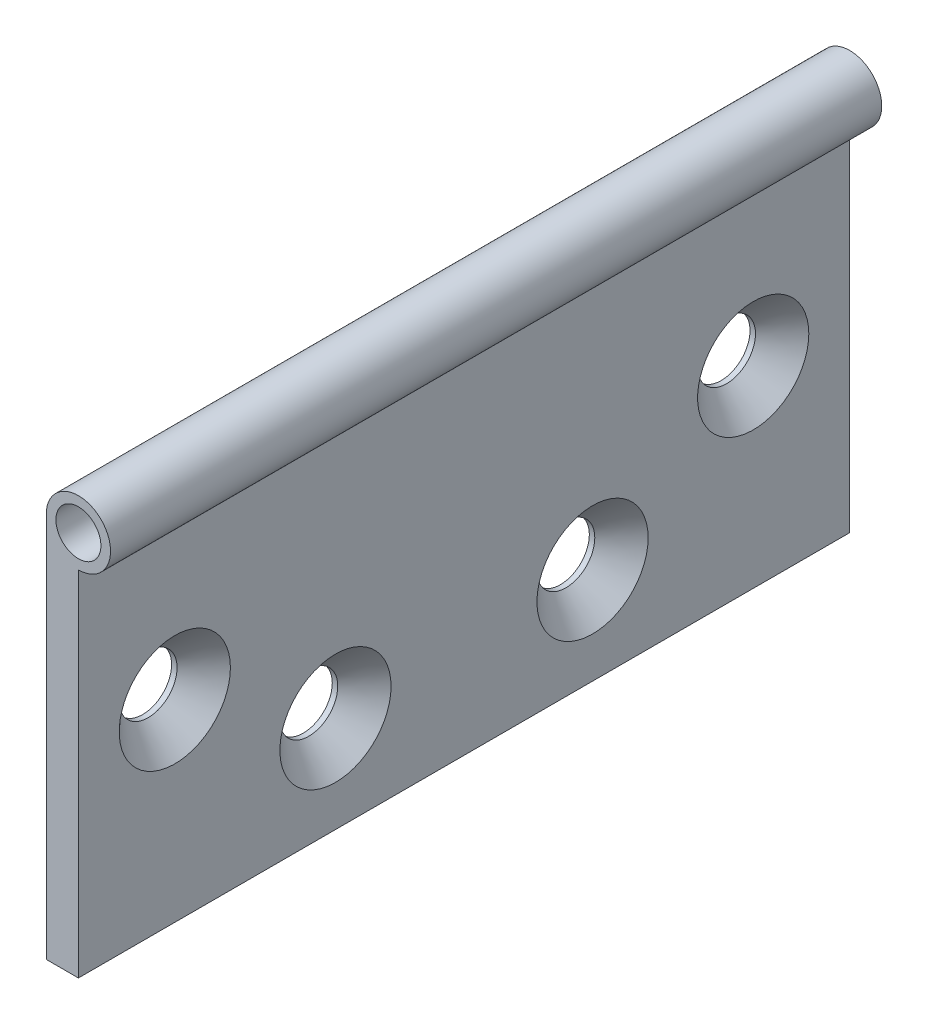
ISO-10303-21;
HEADER;
FILE_DESCRIPTION(('STEP AP214'),'2;1');
FILE_NAME('part.step','',(''),(''),'','','');
FILE_SCHEMA(('AUTOMOTIVE_DESIGN { 1 0 10303 214 1 1 1 1 }'));
ENDSEC;
DATA;
#1=APPLICATION_CONTEXT('core data for automotive mechanical design processes');
#2=APPLICATION_PROTOCOL_DEFINITION('international standard','automotive_design',2000,#1);
#3=PRODUCT_CONTEXT('',#1,'mechanical');
#4=PRODUCT('Part','Part','',(#3));
#5=PRODUCT_RELATED_PRODUCT_CATEGORY('part','',(#4));
#6=PRODUCT_DEFINITION_FORMATION('','',#4);
#7=PRODUCT_DEFINITION_CONTEXT('part definition',#1,'design');
#8=PRODUCT_DEFINITION('design','',#6,#7);
#9=PRODUCT_DEFINITION_SHAPE('','',#8);
#10=(LENGTH_UNIT() NAMED_UNIT(*) SI_UNIT(.MILLI.,.METRE.));
#11=(NAMED_UNIT(*) PLANE_ANGLE_UNIT() SI_UNIT($,.RADIAN.));
#12=(NAMED_UNIT(*) SI_UNIT($,.STERADIAN.) SOLID_ANGLE_UNIT());
#13=UNCERTAINTY_MEASURE_WITH_UNIT(LENGTH_MEASURE(1.E-05),#10,'distance_accuracy_value','');
#14=(GEOMETRIC_REPRESENTATION_CONTEXT(3) GLOBAL_UNCERTAINTY_ASSIGNED_CONTEXT((#13)) GLOBAL_UNIT_ASSIGNED_CONTEXT((#10,
#11,#12)) REPRESENTATION_CONTEXT('',''));
#15=CARTESIAN_POINT('',(0.,0.,0.));
#16=DIRECTION('',(0.,0.,1.));
#17=DIRECTION('',(1.,0.,0.));
#18=AXIS2_PLACEMENT_3D('',#15,#16,#17);
#19=CARTESIAN_POINT('',(5.,0.,60.));
#20=DIRECTION('',(-1.,0.,0.));
#21=DIRECTION('',(0.,0.,1.));
#22=AXIS2_PLACEMENT_3D('',#19,#20,#21);
#23=PLANE('',#22);
#24=CARTESIAN_POINT('',(5.,30.,-45.));
#25=DIRECTION('',(1.,0.,0.));
#26=DIRECTION('',(0.,0.,-1.));
#27=AXIS2_PLACEMENT_3D('',#24,#25,#26);
#28=CIRCLE('',#27,8.65);
#29=CARTESIAN_POINT('',(5.,30.,-53.65));
#30=VERTEX_POINT('',#29);
#31=EDGE_CURVE('E136',#30,#30,#28,.T.);
#32=ORIENTED_EDGE('',*,*,#31,.F.);
#33=EDGE_LOOP('',(#32));
#34=FACE_BOUND('',#33,.T.);
#35=CARTESIAN_POINT('',(5.,15.,-20.));
#36=DIRECTION('',(1.,0.,0.));
#37=DIRECTION('',(0.,0.,-1.));
#38=AXIS2_PLACEMENT_3D('',#35,#36,#37);
#39=CIRCLE('',#38,8.65);
#40=CARTESIAN_POINT('',(5.,15.,-28.65));
#41=VERTEX_POINT('',#40);
#42=EDGE_CURVE('E127',#41,#41,#39,.T.);
#43=ORIENTED_EDGE('',*,*,#42,.F.);
#44=EDGE_LOOP('',(#43));
#45=FACE_BOUND('',#44,.T.);
#46=CARTESIAN_POINT('',(5.,30.,45.));
#47=DIRECTION('',(1.,0.,0.));
#48=DIRECTION('',(0.,0.,-1.));
#49=AXIS2_PLACEMENT_3D('',#46,#47,#48);
#50=CIRCLE('',#49,8.65);
#51=CARTESIAN_POINT('',(5.,30.,36.35));
#52=VERTEX_POINT('',#51);
#53=EDGE_CURVE('E118',#52,#52,#50,.T.);
#54=ORIENTED_EDGE('',*,*,#53,.F.);
#55=EDGE_LOOP('',(#54));
#56=FACE_BOUND('',#55,.T.);
#57=CARTESIAN_POINT('',(5.,15.,20.));
#58=DIRECTION('',(1.,0.,0.));
#59=DIRECTION('',(0.,0.,-1.));
#60=AXIS2_PLACEMENT_3D('',#57,#58,#59);
#61=CIRCLE('',#60,8.65);
#62=CARTESIAN_POINT('',(5.,15.,11.35));
#63=VERTEX_POINT('',#62);
#64=EDGE_CURVE('E109',#63,#63,#61,.T.);
#65=ORIENTED_EDGE('',*,*,#64,.F.);
#66=EDGE_LOOP('',(#65));
#67=FACE_BOUND('',#66,.T.);
#68=DIRECTION('',(0.,1.,0.));
#69=VECTOR('',#68,1.);
#70=CARTESIAN_POINT('',(5.,0.,-60.));
#71=LINE('',#70,#69);
#72=CARTESIAN_POINT('',(5.,0.,-60.));
#73=VERTEX_POINT('',#72);
#74=CARTESIAN_POINT('',(5.,55.,-60.));
#75=VERTEX_POINT('',#74);
#76=EDGE_CURVE('E67',#73,#75,#71,.T.);
#77=ORIENTED_EDGE('',*,*,#76,.T.);
#78=DIRECTION('',(0.,0.,1.));
#79=VECTOR('',#78,1.);
#80=CARTESIAN_POINT('',(5.,55.,-60.));
#81=LINE('',#80,#79);
#82=CARTESIAN_POINT('',(5.,55.,60.));
#83=VERTEX_POINT('',#82);
#84=EDGE_CURVE('E81',#75,#83,#81,.T.);
#85=ORIENTED_EDGE('',*,*,#84,.T.);
#86=DIRECTION('',(0.,1.,0.));
#87=VECTOR('',#86,1.);
#88=CARTESIAN_POINT('',(5.,0.,60.));
#89=LINE('',#88,#87);
#90=CARTESIAN_POINT('',(5.,0.,60.));
#91=VERTEX_POINT('',#90);
#92=EDGE_CURVE('E69',#91,#83,#89,.T.);
#93=ORIENTED_EDGE('',*,*,#92,.F.);
#94=DIRECTION('',(0.,0.,-1.));
#95=VECTOR('',#94,1.);
#96=CARTESIAN_POINT('',(5.,0.,60.));
#97=LINE('',#96,#95);
#98=EDGE_CURVE('E50',#91,#73,#97,.T.);
#99=ORIENTED_EDGE('',*,*,#98,.T.);
#100=EDGE_LOOP('',(#77,#85,#93,#99));
#101=FACE_BOUND('',#100,.T.);
#102=ADVANCED_FACE('F34',(#34,#45,#56,#67,#101),#23,.F.);
#103=CARTESIAN_POINT('',(0.,0.,60.));
#104=DIRECTION('',(-1.,0.,0.));
#105=DIRECTION('',(0.,0.,1.));
#106=AXIS2_PLACEMENT_3D('',#103,#104,#105);
#107=PLANE('',#106);
#108=CARTESIAN_POINT('',(0.,30.,-45.));
#109=DIRECTION('',(1.,0.,0.));
#110=DIRECTION('',(0.,0.,-1.));
#111=AXIS2_PLACEMENT_3D('',#108,#109,#110);
#112=CIRCLE('',#111,4.5);
#113=CARTESIAN_POINT('',(0.,30.,-49.5));
#114=VERTEX_POINT('',#113);
#115=EDGE_CURVE('E130',#114,#114,#112,.T.);
#116=ORIENTED_EDGE('',*,*,#115,.T.);
#117=EDGE_LOOP('',(#116));
#118=FACE_BOUND('',#117,.T.);
#119=CARTESIAN_POINT('',(0.,15.,-20.));
#120=DIRECTION('',(1.,0.,0.));
#121=DIRECTION('',(0.,0.,-1.));
#122=AXIS2_PLACEMENT_3D('',#119,#120,#121);
#123=CIRCLE('',#122,4.5);
#124=CARTESIAN_POINT('',(0.,15.,-24.5));
#125=VERTEX_POINT('',#124);
#126=EDGE_CURVE('E121',#125,#125,#123,.T.);
#127=ORIENTED_EDGE('',*,*,#126,.T.);
#128=EDGE_LOOP('',(#127));
#129=FACE_BOUND('',#128,.T.);
#130=CARTESIAN_POINT('',(0.,30.,45.));
#131=DIRECTION('',(1.,0.,0.));
#132=DIRECTION('',(0.,0.,-1.));
#133=AXIS2_PLACEMENT_3D('',#130,#131,#132);
#134=CIRCLE('',#133,4.5);
#135=CARTESIAN_POINT('',(0.,30.,40.5));
#136=VERTEX_POINT('',#135);
#137=EDGE_CURVE('E112',#136,#136,#134,.T.);
#138=ORIENTED_EDGE('',*,*,#137,.T.);
#139=EDGE_LOOP('',(#138));
#140=FACE_BOUND('',#139,.T.);
#141=CARTESIAN_POINT('',(0.,15.,20.));
#142=DIRECTION('',(1.,0.,0.));
#143=DIRECTION('',(0.,0.,-1.));
#144=AXIS2_PLACEMENT_3D('',#141,#142,#143);
#145=CIRCLE('',#144,4.5);
#146=CARTESIAN_POINT('',(0.,15.,15.5));
#147=VERTEX_POINT('',#146);
#148=EDGE_CURVE('E101',#147,#147,#145,.T.);
#149=ORIENTED_EDGE('',*,*,#148,.T.);
#150=EDGE_LOOP('',(#149));
#151=FACE_BOUND('',#150,.T.);
#152=DIRECTION('',(0.,1.,0.));
#153=VECTOR('',#152,1.);
#154=CARTESIAN_POINT('',(0.,0.,-60.));
#155=LINE('',#154,#153);
#156=CARTESIAN_POINT('',(0.,0.,-60.));
#157=VERTEX_POINT('',#156);
#158=CARTESIAN_POINT('',(0.,60.,-60.));
#159=VERTEX_POINT('',#158);
#160=EDGE_CURVE('E80',#157,#159,#155,.T.);
#161=ORIENTED_EDGE('',*,*,#160,.F.);
#162=DIRECTION('',(0.,0.,-1.));
#163=VECTOR('',#162,1.);
#164=CARTESIAN_POINT('',(0.,0.,60.));
#165=LINE('',#164,#163);
#166=CARTESIAN_POINT('',(0.,0.,60.));
#167=VERTEX_POINT('',#166);
#168=EDGE_CURVE('E42',#167,#157,#165,.T.);
#169=ORIENTED_EDGE('',*,*,#168,.F.);
#170=DIRECTION('',(0.,1.,0.));
#171=VECTOR('',#170,1.);
#172=CARTESIAN_POINT('',(0.,0.,60.));
#173=LINE('',#172,#171);
#174=CARTESIAN_POINT('',(0.,60.,60.));
#175=VERTEX_POINT('',#174);
#176=EDGE_CURVE('E85',#167,#175,#173,.T.);
#177=ORIENTED_EDGE('',*,*,#176,.T.);
#178=DIRECTION('',(0.,0.,-1.));
#179=VECTOR('',#178,1.);
#180=CARTESIAN_POINT('',(0.,60.,60.));
#181=LINE('',#180,#179);
#182=EDGE_CURVE('E11',#175,#159,#181,.T.);
#183=ORIENTED_EDGE('',*,*,#182,.T.);
#184=EDGE_LOOP('',(#161,#169,#177,#183));
#185=FACE_BOUND('',#184,.T.);
#186=ADVANCED_FACE('F144',(#118,#129,#140,#151,#185),#107,.T.);
#187=CARTESIAN_POINT('',(5.,0.,60.));
#188=DIRECTION('',(0.,-1.,0.));
#189=DIRECTION('',(0.,0.,-1.));
#190=AXIS2_PLACEMENT_3D('',#187,#188,#189);
#191=PLANE('',#190);
#192=DIRECTION('',(-1.,0.,0.));
#193=VECTOR('',#192,1.);
#194=CARTESIAN_POINT('',(5.,0.,-60.));
#195=LINE('',#194,#193);
#196=EDGE_CURVE('E78',#73,#157,#195,.T.);
#197=ORIENTED_EDGE('',*,*,#196,.F.);
#198=ORIENTED_EDGE('',*,*,#98,.F.);
#199=DIRECTION('',(-1.,0.,0.));
#200=VECTOR('',#199,1.);
#201=CARTESIAN_POINT('',(5.,0.,60.));
#202=LINE('',#201,#200);
#203=EDGE_CURVE('E71',#91,#167,#202,.T.);
#204=ORIENTED_EDGE('',*,*,#203,.T.);
#205=ORIENTED_EDGE('',*,*,#168,.T.);
#206=EDGE_LOOP('',(#197,#198,#204,#205));
#207=FACE_BOUND('',#206,.T.);
#208=ADVANCED_FACE('F83',(#207),#191,.T.);
#209=CARTESIAN_POINT('',(0.,0.,60.));
#210=DIRECTION('',(0.,0.,-1.));
#211=DIRECTION('',(-1.,0.,0.));
#212=AXIS2_PLACEMENT_3D('',#209,#210,#211);
#213=PLANE('',#212);
#214=CARTESIAN_POINT('',(5.,60.,60.));
#215=DIRECTION('',(0.,0.,1.));
#216=DIRECTION('',(1.,0.,0.));
#217=AXIS2_PLACEMENT_3D('',#214,#215,#216);
#218=CIRCLE('',#217,3.5);
#219=CARTESIAN_POINT('',(8.5,60.,60.));
#220=VERTEX_POINT('',#219);
#221=EDGE_CURVE('E98',#220,#220,#218,.T.);
#222=ORIENTED_EDGE('',*,*,#221,.F.);
#223=EDGE_LOOP('',(#222));
#224=FACE_BOUND('',#223,.T.);
#225=ORIENTED_EDGE('',*,*,#92,.T.);
#226=CARTESIAN_POINT('',(5.,60.,60.));
#227=DIRECTION('',(0.,0.,1.));
#228=DIRECTION('',(1.,0.,0.));
#229=AXIS2_PLACEMENT_3D('',#226,#227,#228);
#230=CIRCLE('',#229,5.);
#231=EDGE_CURVE('E93',#83,#175,#230,.T.);
#232=ORIENTED_EDGE('',*,*,#231,.T.);
#233=ORIENTED_EDGE('',*,*,#176,.F.);
#234=ORIENTED_EDGE('',*,*,#203,.F.);
#235=EDGE_LOOP('',(#225,#232,#233,#234));
#236=FACE_BOUND('',#235,.T.);
#237=ADVANCED_FACE('F177',(#224,#236),#213,.F.);
#238=CARTESIAN_POINT('',(0.,0.,-60.));
#239=DIRECTION('',(0.,0.,-1.));
#240=DIRECTION('',(-1.,0.,0.));
#241=AXIS2_PLACEMENT_3D('',#238,#239,#240);
#242=PLANE('',#241);
#243=CARTESIAN_POINT('',(5.,60.,-60.));
#244=DIRECTION('',(0.,0.,1.));
#245=DIRECTION('',(1.,0.,0.));
#246=AXIS2_PLACEMENT_3D('',#243,#244,#245);
#247=CIRCLE('',#246,3.5);
#248=CARTESIAN_POINT('',(8.5,60.,-60.));
#249=VERTEX_POINT('',#248);
#250=EDGE_CURVE('E96',#249,#249,#247,.T.);
#251=ORIENTED_EDGE('',*,*,#250,.T.);
#252=EDGE_LOOP('',(#251));
#253=FACE_BOUND('',#252,.T.);
#254=ORIENTED_EDGE('',*,*,#160,.T.);
#255=CARTESIAN_POINT('',(5.,60.,-60.));
#256=DIRECTION('',(0.,0.,1.));
#257=DIRECTION('',(1.,0.,0.));
#258=AXIS2_PLACEMENT_3D('',#255,#256,#257);
#259=CIRCLE('',#258,5.);
#260=EDGE_CURVE('E79',#75,#159,#259,.T.);
#261=ORIENTED_EDGE('',*,*,#260,.F.);
#262=ORIENTED_EDGE('',*,*,#76,.F.);
#263=ORIENTED_EDGE('',*,*,#196,.T.);
#264=EDGE_LOOP('',(#254,#261,#262,#263));
#265=FACE_BOUND('',#264,.T.);
#266=ADVANCED_FACE('F77',(#253,#265),#242,.T.);
#267=CARTESIAN_POINT('',(5.,60.,-60.));
#268=DIRECTION('',(0.,0.,1.));
#269=DIRECTION('',(1.,0.,0.));
#270=AXIS2_PLACEMENT_3D('',#267,#268,#269);
#271=CYLINDRICAL_SURFACE('',#270,5.);
#272=ORIENTED_EDGE('',*,*,#84,.F.);
#273=ORIENTED_EDGE('',*,*,#260,.T.);
#274=ORIENTED_EDGE('',*,*,#182,.F.);
#275=ORIENTED_EDGE('',*,*,#231,.F.);
#276=EDGE_LOOP('',(#272,#273,#274,#275));
#277=FACE_BOUND('',#276,.T.);
#278=ADVANCED_FACE('F172',(#277),#271,.T.);
#279=CARTESIAN_POINT('',(5.,60.,-60.));
#280=DIRECTION('',(0.,0.,1.));
#281=DIRECTION('',(1.,0.,0.));
#282=AXIS2_PLACEMENT_3D('',#279,#280,#281);
#283=CYLINDRICAL_SURFACE('',#282,3.5);
#284=ORIENTED_EDGE('',*,*,#250,.F.);
#285=EDGE_LOOP('',(#284));
#286=FACE_BOUND('',#285,.T.);
#287=ORIENTED_EDGE('',*,*,#221,.T.);
#288=EDGE_LOOP('',(#287));
#289=FACE_BOUND('',#288,.T.);
#290=ADVANCED_FACE('F164',(#286,#289),#283,.F.);
#291=CARTESIAN_POINT('',(5.,15.,20.));
#292=DIRECTION('',(1.,0.,0.));
#293=DIRECTION('',(0.,0.,-1.));
#294=AXIS2_PLACEMENT_3D('',#291,#292,#293);
#295=CYLINDRICAL_SURFACE('',#294,4.5);
#296=ORIENTED_EDGE('',*,*,#148,.F.);
#297=EDGE_LOOP('',(#296));
#298=FACE_BOUND('',#297,.T.);
#299=CARTESIAN_POINT('',(0.850000000000003,15.,20.));
#300=DIRECTION('',(1.,0.,0.));
#301=DIRECTION('',(0.,0.,-1.));
#302=AXIS2_PLACEMENT_3D('',#299,#300,#301);
#303=CIRCLE('',#302,4.5);
#304=CARTESIAN_POINT('',(0.850000000000003,15.,15.5));
#305=VERTEX_POINT('',#304);
#306=EDGE_CURVE('E106',#305,#305,#303,.T.);
#307=ORIENTED_EDGE('',*,*,#306,.T.);
#308=EDGE_LOOP('',(#307));
#309=FACE_BOUND('',#308,.T.);
#310=ADVANCED_FACE('F154',(#298,#309),#295,.F.);
#311=CARTESIAN_POINT('',(5.,15.,20.));
#312=DIRECTION('',(1.,0.,0.));
#313=DIRECTION('',(0.,0.,-1.));
#314=AXIS2_PLACEMENT_3D('',#311,#312,#313);
#315=CONICAL_SURFACE('',#314,8.65,0.785398163397448);
#316=ORIENTED_EDGE('',*,*,#306,.F.);
#317=EDGE_LOOP('',(#316));
#318=FACE_BOUND('',#317,.T.);
#319=ORIENTED_EDGE('',*,*,#64,.T.);
#320=EDGE_LOOP('',(#319));
#321=FACE_BOUND('',#320,.T.);
#322=ADVANCED_FACE('F151',(#318,#321),#315,.F.);
#323=CARTESIAN_POINT('',(5.,30.,45.));
#324=DIRECTION('',(1.,0.,0.));
#325=DIRECTION('',(0.,0.,-1.));
#326=AXIS2_PLACEMENT_3D('',#323,#324,#325);
#327=CYLINDRICAL_SURFACE('',#326,4.5);
#328=ORIENTED_EDGE('',*,*,#137,.F.);
#329=EDGE_LOOP('',(#328));
#330=FACE_BOUND('',#329,.T.);
#331=CARTESIAN_POINT('',(0.850000000000003,30.,45.));
#332=DIRECTION('',(1.,0.,0.));
#333=DIRECTION('',(0.,0.,-1.));
#334=AXIS2_PLACEMENT_3D('',#331,#332,#333);
#335=CIRCLE('',#334,4.5);
#336=CARTESIAN_POINT('',(0.850000000000003,30.,40.5));
#337=VERTEX_POINT('',#336);
#338=EDGE_CURVE('E115',#337,#337,#335,.T.);
#339=ORIENTED_EDGE('',*,*,#338,.T.);
#340=EDGE_LOOP('',(#339));
#341=FACE_BOUND('',#340,.T.);
#342=ADVANCED_FACE('F153',(#330,#341),#327,.F.);
#343=CARTESIAN_POINT('',(5.,30.,45.));
#344=DIRECTION('',(1.,0.,0.));
#345=DIRECTION('',(0.,0.,-1.));
#346=AXIS2_PLACEMENT_3D('',#343,#344,#345);
#347=CONICAL_SURFACE('',#346,8.65,0.785398163397449);
#348=ORIENTED_EDGE('',*,*,#338,.F.);
#349=EDGE_LOOP('',(#348));
#350=FACE_BOUND('',#349,.T.);
#351=ORIENTED_EDGE('',*,*,#53,.T.);
#352=EDGE_LOOP('',(#351));
#353=FACE_BOUND('',#352,.T.);
#354=ADVANCED_FACE('F161',(#350,#353),#347,.F.);
#355=CARTESIAN_POINT('',(5.,15.,-20.));
#356=DIRECTION('',(1.,0.,0.));
#357=DIRECTION('',(0.,0.,-1.));
#358=AXIS2_PLACEMENT_3D('',#355,#356,#357);
#359=CYLINDRICAL_SURFACE('',#358,4.5);
#360=ORIENTED_EDGE('',*,*,#126,.F.);
#361=EDGE_LOOP('',(#360));
#362=FACE_BOUND('',#361,.T.);
#363=CARTESIAN_POINT('',(0.850000000000003,15.,-20.));
#364=DIRECTION('',(1.,0.,0.));
#365=DIRECTION('',(0.,0.,-1.));
#366=AXIS2_PLACEMENT_3D('',#363,#364,#365);
#367=CIRCLE('',#366,4.5);
#368=CARTESIAN_POINT('',(0.850000000000003,15.,-24.5));
#369=VERTEX_POINT('',#368);
#370=EDGE_CURVE('E124',#369,#369,#367,.T.);
#371=ORIENTED_EDGE('',*,*,#370,.T.);
#372=EDGE_LOOP('',(#371));
#373=FACE_BOUND('',#372,.T.);
#374=ADVANCED_FACE('F211',(#362,#373),#359,.F.);
#375=CARTESIAN_POINT('',(5.,15.,-20.));
#376=DIRECTION('',(1.,0.,0.));
#377=DIRECTION('',(0.,0.,-1.));
#378=AXIS2_PLACEMENT_3D('',#375,#376,#377);
#379=CONICAL_SURFACE('',#378,8.65,0.785398163397448);
#380=ORIENTED_EDGE('',*,*,#370,.F.);
#381=EDGE_LOOP('',(#380));
#382=FACE_BOUND('',#381,.T.);
#383=ORIENTED_EDGE('',*,*,#42,.T.);
#384=EDGE_LOOP('',(#383));
#385=FACE_BOUND('',#384,.T.);
#386=ADVANCED_FACE('F215',(#382,#385),#379,.F.);
#387=CARTESIAN_POINT('',(5.,30.,-45.));
#388=DIRECTION('',(1.,0.,0.));
#389=DIRECTION('',(0.,0.,-1.));
#390=AXIS2_PLACEMENT_3D('',#387,#388,#389);
#391=CYLINDRICAL_SURFACE('',#390,4.5);
#392=ORIENTED_EDGE('',*,*,#115,.F.);
#393=EDGE_LOOP('',(#392));
#394=FACE_BOUND('',#393,.T.);
#395=CARTESIAN_POINT('',(0.850000000000003,30.,-45.));
#396=DIRECTION('',(1.,0.,0.));
#397=DIRECTION('',(0.,0.,-1.));
#398=AXIS2_PLACEMENT_3D('',#395,#396,#397);
#399=CIRCLE('',#398,4.5);
#400=CARTESIAN_POINT('',(0.850000000000003,30.,-49.5));
#401=VERTEX_POINT('',#400);
#402=EDGE_CURVE('E133',#401,#401,#399,.T.);
#403=ORIENTED_EDGE('',*,*,#402,.T.);
#404=EDGE_LOOP('',(#403));
#405=FACE_BOUND('',#404,.T.);
#406=ADVANCED_FACE('F221',(#394,#405),#391,.F.);
#407=CARTESIAN_POINT('',(5.,30.,-45.));
#408=DIRECTION('',(1.,0.,0.));
#409=DIRECTION('',(0.,0.,-1.));
#410=AXIS2_PLACEMENT_3D('',#407,#408,#409);
#411=CONICAL_SURFACE('',#410,8.65,0.785398163397449);
#412=ORIENTED_EDGE('',*,*,#402,.F.);
#413=EDGE_LOOP('',(#412));
#414=FACE_BOUND('',#413,.T.);
#415=ORIENTED_EDGE('',*,*,#31,.T.);
#416=EDGE_LOOP('',(#415));
#417=FACE_BOUND('',#416,.T.);
#418=ADVANCED_FACE('F140',(#414,#417),#411,.F.);
#419=CLOSED_SHELL('',(#102,#186,#208,#237,#266,#278,#290,#310,#322,#342,#354,#374,#386,#406,#418));
#420=MANIFOLD_SOLID_BREP('B2',#419);
#421=ADVANCED_BREP_SHAPE_REPRESENTATION('',(#18,#420),#14);
#422=SHAPE_DEFINITION_REPRESENTATION(#9,#421);
ENDSEC;
END-ISO-10303-21;
